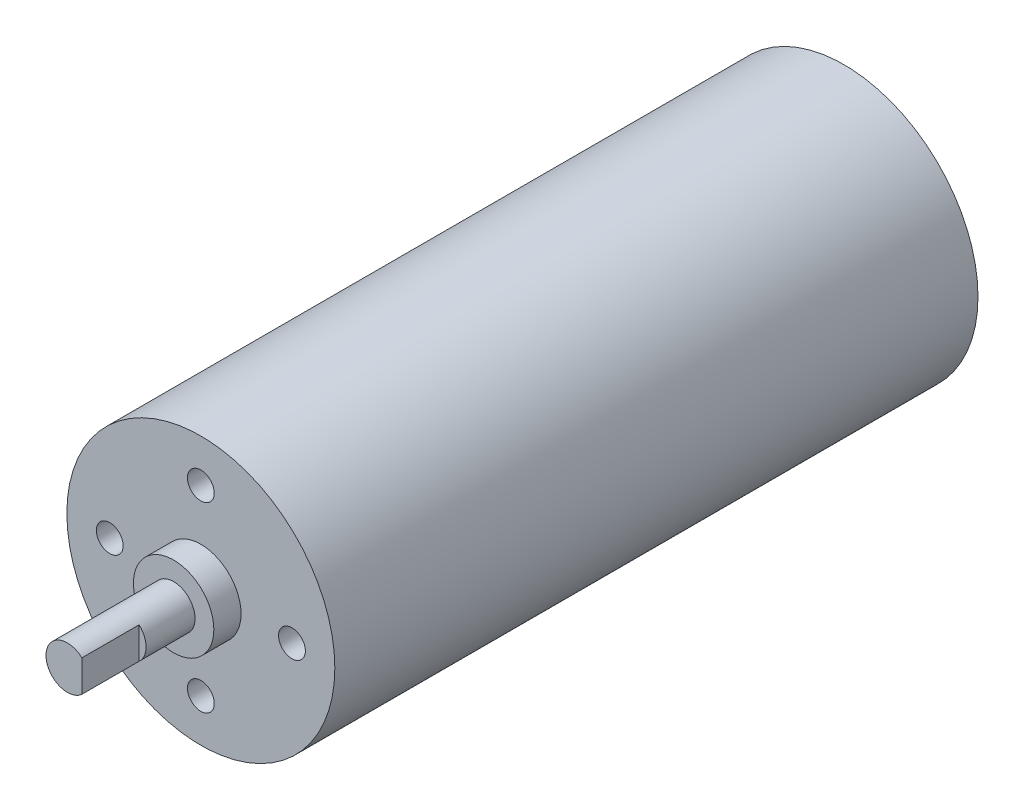
ISO-10303-21;
HEADER;
FILE_DESCRIPTION(('STEP AP214'),'2;1');
FILE_NAME('part.step','',(''),(''),'','','');
FILE_SCHEMA(('AUTOMOTIVE_DESIGN { 1 0 10303 214 1 1 1 1 }'));
ENDSEC;
DATA;
#1=APPLICATION_CONTEXT('core data for automotive mechanical design processes');
#2=APPLICATION_PROTOCOL_DEFINITION('international standard','automotive_design',2000,#1);
#3=PRODUCT_CONTEXT('',#1,'mechanical');
#4=PRODUCT('Part','Part','',(#3));
#5=PRODUCT_RELATED_PRODUCT_CATEGORY('part','',(#4));
#6=PRODUCT_DEFINITION_FORMATION('','',#4);
#7=PRODUCT_DEFINITION_CONTEXT('part definition',#1,'design');
#8=PRODUCT_DEFINITION('design','',#6,#7);
#9=PRODUCT_DEFINITION_SHAPE('','',#8);
#10=(LENGTH_UNIT() NAMED_UNIT(*) SI_UNIT(.MILLI.,.METRE.));
#11=(NAMED_UNIT(*) PLANE_ANGLE_UNIT() SI_UNIT($,.RADIAN.));
#12=(NAMED_UNIT(*) SI_UNIT($,.STERADIAN.) SOLID_ANGLE_UNIT());
#13=UNCERTAINTY_MEASURE_WITH_UNIT(LENGTH_MEASURE(1.E-05),#10,'distance_accuracy_value','');
#14=(GEOMETRIC_REPRESENTATION_CONTEXT(3) GLOBAL_UNCERTAINTY_ASSIGNED_CONTEXT((#13)) GLOBAL_UNIT_ASSIGNED_CONTEXT((#10,
#11,#12)) REPRESENTATION_CONTEXT('',''));
#15=CARTESIAN_POINT('',(0.,0.,0.));
#16=DIRECTION('',(0.,0.,1.));
#17=DIRECTION('',(1.,0.,0.));
#18=AXIS2_PLACEMENT_3D('',#15,#16,#17);
#19=CARTESIAN_POINT('',(0.,0.,-60.));
#20=DIRECTION('',(0.,0.,1.));
#21=DIRECTION('',(1.,0.,0.));
#22=AXIS2_PLACEMENT_3D('',#19,#20,#21);
#23=CYLINDRICAL_SURFACE('',#22,12.5);
#24=CARTESIAN_POINT('',(0.,0.,-60.));
#25=DIRECTION('',(0.,0.,1.));
#26=DIRECTION('',(1.,0.,0.));
#27=AXIS2_PLACEMENT_3D('',#24,#25,#26);
#28=CIRCLE('',#27,12.5);
#29=CARTESIAN_POINT('',(12.5,0.,-60.));
#30=VERTEX_POINT('',#29);
#31=EDGE_CURVE('E11',#30,#30,#28,.T.);
#32=CARTESIAN_POINT('',(0.,0.,0.));
#33=DIRECTION('',(0.,0.,1.));
#34=DIRECTION('',(1.,0.,0.));
#35=AXIS2_PLACEMENT_3D('',#32,#33,#34);
#36=CIRCLE('',#35,12.5);
#37=CARTESIAN_POINT('',(12.5,0.,0.));
#38=VERTEX_POINT('',#37);
#39=EDGE_CURVE('E43',#38,#38,#36,.T.);
#40=CARTESIAN_POINT('',(12.5,0.,-60.));
#41=CARTESIAN_POINT('',(12.5,0.,-59.375));
#42=CARTESIAN_POINT('',(12.5,0.,-58.75));
#43=CARTESIAN_POINT('',(12.5,0.,-57.5));
#44=CARTESIAN_POINT('',(12.5,0.,-56.875));
#45=CARTESIAN_POINT('',(12.5,0.,-55.625));
#46=CARTESIAN_POINT('',(12.5,0.,-55.));
#47=CARTESIAN_POINT('',(12.5,0.,-53.75));
#48=CARTESIAN_POINT('',(12.5,0.,-53.125));
#49=CARTESIAN_POINT('',(12.5,0.,-51.875));
#50=CARTESIAN_POINT('',(12.5,0.,-51.25));
#51=CARTESIAN_POINT('',(12.5,0.,-50.));
#52=CARTESIAN_POINT('',(12.5,0.,-49.375));
#53=CARTESIAN_POINT('',(12.5,0.,-48.125));
#54=CARTESIAN_POINT('',(12.5,0.,-47.5));
#55=CARTESIAN_POINT('',(12.5,0.,-46.25));
#56=CARTESIAN_POINT('',(12.5,0.,-45.625));
#57=CARTESIAN_POINT('',(12.5,0.,-44.375));
#58=CARTESIAN_POINT('',(12.5,0.,-43.75));
#59=CARTESIAN_POINT('',(12.5,0.,-42.5));
#60=CARTESIAN_POINT('',(12.5,0.,-41.875));
#61=CARTESIAN_POINT('',(12.5,0.,-40.625));
#62=CARTESIAN_POINT('',(12.5,0.,-40.));
#63=CARTESIAN_POINT('',(12.5,0.,-38.75));
#64=CARTESIAN_POINT('',(12.5,0.,-38.125));
#65=CARTESIAN_POINT('',(12.5,0.,-36.875));
#66=CARTESIAN_POINT('',(12.5,0.,-36.25));
#67=CARTESIAN_POINT('',(12.5,0.,-35.));
#68=CARTESIAN_POINT('',(12.5,0.,-34.375));
#69=CARTESIAN_POINT('',(12.5,0.,-33.125));
#70=CARTESIAN_POINT('',(12.5,0.,-32.5));
#71=CARTESIAN_POINT('',(12.5,0.,-31.25));
#72=CARTESIAN_POINT('',(12.5,0.,-30.625));
#73=CARTESIAN_POINT('',(12.5,0.,-29.375));
#74=CARTESIAN_POINT('',(12.5,0.,-28.75));
#75=CARTESIAN_POINT('',(12.5,0.,-27.5));
#76=CARTESIAN_POINT('',(12.5,0.,-26.875));
#77=CARTESIAN_POINT('',(12.5,0.,-25.625));
#78=CARTESIAN_POINT('',(12.5,0.,-25.));
#79=CARTESIAN_POINT('',(12.5,0.,-23.75));
#80=CARTESIAN_POINT('',(12.5,0.,-23.125));
#81=CARTESIAN_POINT('',(12.5,0.,-21.875));
#82=CARTESIAN_POINT('',(12.5,0.,-21.25));
#83=CARTESIAN_POINT('',(12.5,0.,-20.));
#84=CARTESIAN_POINT('',(12.5,0.,-19.375));
#85=CARTESIAN_POINT('',(12.5,0.,-18.125));
#86=CARTESIAN_POINT('',(12.5,0.,-17.5));
#87=CARTESIAN_POINT('',(12.5,0.,-16.25));
#88=CARTESIAN_POINT('',(12.5,0.,-15.625));
#89=CARTESIAN_POINT('',(12.5,0.,-14.375));
#90=CARTESIAN_POINT('',(12.5,0.,-13.75));
#91=CARTESIAN_POINT('',(12.5,0.,-12.5));
#92=CARTESIAN_POINT('',(12.5,0.,-11.875));
#93=CARTESIAN_POINT('',(12.5,0.,-10.625));
#94=CARTESIAN_POINT('',(12.5,0.,-10.));
#95=CARTESIAN_POINT('',(12.5,0.,-8.75));
#96=CARTESIAN_POINT('',(12.5,0.,-8.125));
#97=CARTESIAN_POINT('',(12.5,0.,-6.875));
#98=CARTESIAN_POINT('',(12.5,0.,-6.25));
#99=CARTESIAN_POINT('',(12.5,0.,-5.));
#100=CARTESIAN_POINT('',(12.5,0.,-4.375));
#101=CARTESIAN_POINT('',(12.5,0.,-3.125));
#102=CARTESIAN_POINT('',(12.5,0.,-2.5));
#103=CARTESIAN_POINT('',(12.5,0.,-1.25));
#104=CARTESIAN_POINT('',(12.5,0.,-0.625000000000001));
#105=CARTESIAN_POINT('',(12.5,0.,0.));
#106=B_SPLINE_CURVE_WITH_KNOTS('',3,(#40,#41,#42,#43,#44,#45,#46,#47,#48,#49,#50,#51,#52,#53,
#54,#55,#56,#57,#58,#59,#60,#61,#62,#63,#64,#65,#66,#67,#68,#69,#70,#71,#72,#73,#74,#75,#76,#77,
#78,#79,#80,#81,#82,#83,#84,#85,#86,#87,#88,#89,#90,#91,#92,#93,#94,#95,#96,#97,#98,#99,#100,
#101,#102,#103,#104,#105),.UNSPECIFIED.,.F.,.F.,(4,2,2,2,2,2,2,2,2,2,2,2,2,2,2,2,2,2,2,2,2,2,2,
2,2,2,2,2,2,2,2,2,4),(0.,1.875,3.75,5.62500000000001,7.50000000000001,9.37500000000001,11.25,
13.125,15.,16.875,18.75,20.625,22.5,24.375,26.25,28.125,30.,31.875,33.75,35.625,37.5,39.375,
41.25,43.125,45.,46.875,48.75,50.625,52.5,54.375,56.25,58.125,60.),.UNSPECIFIED.);
#107=EDGE_CURVE('BSEAM35',#30,#38,#106,.T.);
#108=ORIENTED_EDGE('',*,*,#31,.T.);
#109=ORIENTED_EDGE('',*,*,#39,.F.);
#110=ORIENTED_EDGE('',*,*,#107,.T.);
#111=ORIENTED_EDGE('',*,*,#107,.F.);
#112=EDGE_LOOP('',(#108,#110,#109,#111));
#113=FACE_BOUND('',#112,.T.);
#114=ADVANCED_FACE('F35',(#113),#23,.T.);
#115=CARTESIAN_POINT('',(0.,0.,-60.));
#116=DIRECTION('',(0.,0.,1.));
#117=DIRECTION('',(1.,0.,0.));
#118=AXIS2_PLACEMENT_3D('',#115,#116,#117);
#119=PLANE('',#118);
#120=ORIENTED_EDGE('',*,*,#31,.F.);
#121=EDGE_LOOP('',(#120));
#122=FACE_BOUND('',#121,.T.);
#123=ADVANCED_FACE('F134',(#122),#119,.F.);
#124=CARTESIAN_POINT('',(0.,0.,0.));
#125=DIRECTION('',(0.,0.,1.));
#126=DIRECTION('',(1.,0.,0.));
#127=AXIS2_PLACEMENT_3D('',#124,#125,#126);
#128=PLANE('',#127);
#129=CARTESIAN_POINT('',(0.,8.5,0.));
#130=DIRECTION('',(0.,0.,1.));
#131=DIRECTION('',(1.,0.,0.));
#132=AXIS2_PLACEMENT_3D('',#129,#130,#131);
#133=CIRCLE('',#132,1.24999999999999);
#134=CARTESIAN_POINT('',(1.24999999999999,8.5,0.));
#135=VERTEX_POINT('',#134);
#136=EDGE_CURVE('E90',#135,#135,#133,.T.);
#137=ORIENTED_EDGE('',*,*,#136,.F.);
#138=EDGE_LOOP('',(#137));
#139=FACE_BOUND('',#138,.T.);
#140=CARTESIAN_POINT('',(8.5,0.,0.));
#141=DIRECTION('',(0.,0.,1.));
#142=DIRECTION('',(1.,0.,0.));
#143=AXIS2_PLACEMENT_3D('',#140,#141,#142);
#144=CIRCLE('',#143,1.24999999999999);
#145=CARTESIAN_POINT('',(9.74999999999999,0.,0.));
#146=VERTEX_POINT('',#145);
#147=EDGE_CURVE('E89',#146,#146,#144,.T.);
#148=ORIENTED_EDGE('',*,*,#147,.F.);
#149=EDGE_LOOP('',(#148));
#150=FACE_BOUND('',#149,.T.);
#151=CARTESIAN_POINT('',(0.,-8.5,0.));
#152=DIRECTION('',(0.,0.,1.));
#153=DIRECTION('',(1.,0.,0.));
#154=AXIS2_PLACEMENT_3D('',#151,#152,#153);
#155=CIRCLE('',#154,1.24999999999999);
#156=CARTESIAN_POINT('',(1.24999999999999,-8.5,0.));
#157=VERTEX_POINT('',#156);
#158=EDGE_CURVE('E100',#157,#157,#155,.T.);
#159=ORIENTED_EDGE('',*,*,#158,.F.);
#160=EDGE_LOOP('',(#159));
#161=FACE_BOUND('',#160,.T.);
#162=CARTESIAN_POINT('',(-8.5,0.,0.));
#163=DIRECTION('',(0.,0.,1.));
#164=DIRECTION('',(1.,0.,0.));
#165=AXIS2_PLACEMENT_3D('',#162,#163,#164);
#166=CIRCLE('',#165,1.24999999999999);
#167=CARTESIAN_POINT('',(-7.25000000000001,0.,0.));
#168=VERTEX_POINT('',#167);
#169=EDGE_CURVE('E106',#168,#168,#166,.T.);
#170=ORIENTED_EDGE('',*,*,#169,.F.);
#171=EDGE_LOOP('',(#170));
#172=FACE_BOUND('',#171,.T.);
#173=CARTESIAN_POINT('',(0.,0.,0.));
#174=DIRECTION('',(0.,0.,1.));
#175=DIRECTION('',(1.,0.,0.));
#176=AXIS2_PLACEMENT_3D('',#173,#174,#175);
#177=CIRCLE('',#176,3.75);
#178=CARTESIAN_POINT('',(3.75,0.,0.));
#179=VERTEX_POINT('',#178);
#180=EDGE_CURVE('E119',#179,#179,#177,.T.);
#181=ORIENTED_EDGE('',*,*,#180,.F.);
#182=EDGE_LOOP('',(#181));
#183=FACE_BOUND('',#182,.T.);
#184=ORIENTED_EDGE('',*,*,#39,.T.);
#185=EDGE_LOOP('',(#184));
#186=FACE_BOUND('',#185,.T.);
#187=ADVANCED_FACE('F131',(#139,#150,#161,#172,#183,#186),#128,.T.);
#188=CARTESIAN_POINT('',(0.,0.,2.54));
#189=DIRECTION('',(0.,0.,-1.));
#190=DIRECTION('',(-1.,0.,0.));
#191=AXIS2_PLACEMENT_3D('',#188,#189,#190);
#192=CYLINDRICAL_SURFACE('',#191,3.75);
#193=CARTESIAN_POINT('',(0.,0.,2.54));
#194=DIRECTION('',(0.,0.,1.));
#195=DIRECTION('',(1.,0.,0.));
#196=AXIS2_PLACEMENT_3D('',#193,#194,#195);
#197=CIRCLE('',#196,3.75);
#198=CARTESIAN_POINT('',(3.75,0.,2.54));
#199=VERTEX_POINT('',#198);
#200=EDGE_CURVE('E121',#199,#199,#197,.T.);
#201=ORIENTED_EDGE('',*,*,#200,.F.);
#202=EDGE_LOOP('',(#201));
#203=FACE_BOUND('',#202,.T.);
#204=ORIENTED_EDGE('',*,*,#180,.T.);
#205=EDGE_LOOP('',(#204));
#206=FACE_BOUND('',#205,.T.);
#207=ADVANCED_FACE('F145',(#203,#206),#192,.T.);
#208=CARTESIAN_POINT('',(0.,0.,2.54));
#209=DIRECTION('',(0.,0.,1.));
#210=DIRECTION('',(1.,0.,0.));
#211=AXIS2_PLACEMENT_3D('',#208,#209,#210);
#212=PLANE('',#211);
#213=CARTESIAN_POINT('',(0.,0.,2.54));
#214=DIRECTION('',(0.,0.,1.));
#215=DIRECTION('',(1.,0.,0.));
#216=AXIS2_PLACEMENT_3D('',#213,#214,#215);
#217=CIRCLE('',#216,2.);
#218=CARTESIAN_POINT('',(2.,0.,2.54));
#219=VERTEX_POINT('',#218);
#220=EDGE_CURVE('E38',#219,#219,#217,.T.);
#221=ORIENTED_EDGE('',*,*,#220,.F.);
#222=EDGE_LOOP('',(#221));
#223=FACE_BOUND('',#222,.T.);
#224=ORIENTED_EDGE('',*,*,#200,.T.);
#225=EDGE_LOOP('',(#224));
#226=FACE_BOUND('',#225,.T.);
#227=ADVANCED_FACE('F156',(#223,#226),#212,.T.);
#228=CARTESIAN_POINT('',(0.,0.,12.446));
#229=DIRECTION('',(0.,0.,1.));
#230=DIRECTION('',(1.,0.,0.));
#231=AXIS2_PLACEMENT_3D('',#228,#229,#230);
#232=PLANE('',#231);
#233=DIRECTION('',(0.,-1.,0.));
#234=VECTOR('',#233,1.);
#235=CARTESIAN_POINT('',(1.35278763968927,1.47308031074478,12.446));
#236=LINE('',#235,#234);
#237=CARTESIAN_POINT('',(1.35278763968927,1.47308031074478,12.446));
#238=VERTEX_POINT('',#237);
#239=CARTESIAN_POINT('',(1.35278763968927,-1.47308031074478,12.446));
#240=VERTEX_POINT('',#239);
#241=EDGE_CURVE('E112',#238,#240,#236,.T.);
#242=ORIENTED_EDGE('',*,*,#241,.F.);
#243=CARTESIAN_POINT('',(0.,0.,12.446));
#244=DIRECTION('',(0.,0.,1.));
#245=DIRECTION('',(1.,0.,0.));
#246=AXIS2_PLACEMENT_3D('',#243,#244,#245);
#247=CIRCLE('',#246,2.);
#248=EDGE_CURVE('E126',#238,#240,#247,.T.);
#249=ORIENTED_EDGE('',*,*,#248,.T.);
#250=EDGE_LOOP('',(#242,#249));
#251=FACE_BOUND('',#250,.T.);
#252=ADVANCED_FACE('F152',(#251),#232,.T.);
#253=CARTESIAN_POINT('',(0.,0.,12.446));
#254=DIRECTION('',(0.,0.,-1.));
#255=DIRECTION('',(-1.,0.,0.));
#256=AXIS2_PLACEMENT_3D('',#253,#254,#255);
#257=CYLINDRICAL_SURFACE('',#256,2.);
#258=ORIENTED_EDGE('',*,*,#248,.F.);
#259=DIRECTION('',(0.,0.,1.));
#260=VECTOR('',#259,1.);
#261=CARTESIAN_POINT('',(1.35278763968927,1.47308031074478,7.112));
#262=LINE('',#261,#260);
#263=CARTESIAN_POINT('',(1.35278763968927,1.47308031074478,7.112));
#264=VERTEX_POINT('',#263);
#265=EDGE_CURVE('E65',#264,#238,#262,.T.);
#266=ORIENTED_EDGE('',*,*,#265,.F.);
#267=CARTESIAN_POINT('',(0.,0.,7.112));
#268=DIRECTION('',(0.,0.,1.));
#269=DIRECTION('',(-1.,0.,0.));
#270=AXIS2_PLACEMENT_3D('',#267,#268,#269);
#271=CIRCLE('',#270,2.);
#272=CARTESIAN_POINT('',(1.35278763968927,-1.47308031074478,7.112));
#273=VERTEX_POINT('',#272);
#274=EDGE_CURVE('E55',#273,#264,#271,.T.);
#275=ORIENTED_EDGE('',*,*,#274,.F.);
#276=DIRECTION('',(0.,0.,1.));
#277=VECTOR('',#276,1.);
#278=CARTESIAN_POINT('',(1.35278763968927,-1.47308031074478,7.112));
#279=LINE('',#278,#277);
#280=EDGE_CURVE('E116',#273,#240,#279,.T.);
#281=ORIENTED_EDGE('',*,*,#280,.T.);
#282=EDGE_LOOP('',(#258,#266,#275,#281));
#283=FACE_BOUND('',#282,.T.);
#284=ORIENTED_EDGE('',*,*,#220,.T.);
#285=EDGE_LOOP('',(#284));
#286=FACE_BOUND('',#285,.T.);
#287=ADVANCED_FACE('F148',(#283,#286),#257,.T.);
#288=CARTESIAN_POINT('',(1.35278763968927,1.47308031074478,7.112));
#289=DIRECTION('',(-1.,0.,0.));
#290=DIRECTION('',(0.,0.,1.));
#291=AXIS2_PLACEMENT_3D('',#288,#289,#290);
#292=PLANE('',#291);
#293=ORIENTED_EDGE('',*,*,#241,.T.);
#294=ORIENTED_EDGE('',*,*,#280,.F.);
#295=DIRECTION('',(0.,-1.,0.));
#296=VECTOR('',#295,1.);
#297=CARTESIAN_POINT('',(1.35278763968927,1.47308031074478,7.112));
#298=LINE('',#297,#296);
#299=EDGE_CURVE('E50',#264,#273,#298,.T.);
#300=ORIENTED_EDGE('',*,*,#299,.F.);
#301=ORIENTED_EDGE('',*,*,#265,.T.);
#302=EDGE_LOOP('',(#293,#294,#300,#301));
#303=FACE_BOUND('',#302,.T.);
#304=ADVANCED_FACE('F151',(#303),#292,.F.);
#305=CARTESIAN_POINT('',(0.,0.,7.112));
#306=DIRECTION('',(0.,0.,-1.));
#307=DIRECTION('',(-1.,0.,0.));
#308=AXIS2_PLACEMENT_3D('',#305,#306,#307);
#309=PLANE('',#308);
#310=ORIENTED_EDGE('',*,*,#274,.T.);
#311=ORIENTED_EDGE('',*,*,#299,.T.);
#312=EDGE_LOOP('',(#310,#311));
#313=FACE_BOUND('',#312,.T.);
#314=ADVANCED_FACE('F166',(#313),#309,.F.);
#315=CARTESIAN_POINT('',(-8.5,0.,-10.0000054));
#316=DIRECTION('',(0.,0.,1.));
#317=DIRECTION('',(1.,0.,0.));
#318=AXIS2_PLACEMENT_3D('',#315,#316,#317);
#319=CONICAL_SURFACE('',#318,1.25,1.02974425867665);
#320=CARTESIAN_POINT('',(-8.5,0.,-10.7510811737845));
#321=VERTEX_POINT('',#320);
#322=VERTEX_LOOP('',#321);
#323=FACE_BOUND('',#322,.T.);
#324=CARTESIAN_POINT('',(-8.5,0.,-10.0000054));
#325=DIRECTION('',(0.,0.,1.));
#326=DIRECTION('',(1.,0.,0.));
#327=AXIS2_PLACEMENT_3D('',#324,#325,#326);
#328=CIRCLE('',#327,1.25);
#329=CARTESIAN_POINT('',(-7.25,0.,-10.0000054));
#330=VERTEX_POINT('',#329);
#331=EDGE_CURVE('E109',#330,#330,#328,.T.);
#332=ORIENTED_EDGE('',*,*,#331,.T.);
#333=EDGE_LOOP('',(#332));
#334=FACE_BOUND('',#333,.T.);
#335=ADVANCED_FACE('F169',(#323,#334),#319,.F.);
#336=CARTESIAN_POINT('',(-8.5,0.,0.));
#337=DIRECTION('',(0.,0.,1.));
#338=DIRECTION('',(1.,0.,0.));
#339=AXIS2_PLACEMENT_3D('',#336,#337,#338);
#340=CYLINDRICAL_SURFACE('',#339,1.24999999999999);
#341=ORIENTED_EDGE('',*,*,#331,.F.);
#342=EDGE_LOOP('',(#341));
#343=FACE_BOUND('',#342,.T.);
#344=ORIENTED_EDGE('',*,*,#169,.T.);
#345=EDGE_LOOP('',(#344));
#346=FACE_BOUND('',#345,.T.);
#347=ADVANCED_FACE('F172',(#343,#346),#340,.F.);
#348=CARTESIAN_POINT('',(0.,-8.5,-10.0000054));
#349=DIRECTION('',(0.,0.,1.));
#350=DIRECTION('',(1.,0.,0.));
#351=AXIS2_PLACEMENT_3D('',#348,#349,#350);
#352=CONICAL_SURFACE('',#351,1.25,1.02974425867665);
#353=CARTESIAN_POINT('',(0.,-8.5,-10.7510811737845));
#354=VERTEX_POINT('',#353);
#355=VERTEX_LOOP('',#354);
#356=FACE_BOUND('',#355,.T.);
#357=CARTESIAN_POINT('',(0.,-8.5,-10.0000054));
#358=DIRECTION('',(0.,0.,1.));
#359=DIRECTION('',(1.,0.,0.));
#360=AXIS2_PLACEMENT_3D('',#357,#358,#359);
#361=CIRCLE('',#360,1.25);
#362=CARTESIAN_POINT('',(1.25,-8.5,-10.0000054));
#363=VERTEX_POINT('',#362);
#364=EDGE_CURVE('E103',#363,#363,#361,.T.);
#365=ORIENTED_EDGE('',*,*,#364,.T.);
#366=EDGE_LOOP('',(#365));
#367=FACE_BOUND('',#366,.T.);
#368=ADVANCED_FACE('F175',(#356,#367),#352,.F.);
#369=CARTESIAN_POINT('',(0.,-8.5,0.));
#370=DIRECTION('',(0.,0.,1.));
#371=DIRECTION('',(1.,0.,0.));
#372=AXIS2_PLACEMENT_3D('',#369,#370,#371);
#373=CYLINDRICAL_SURFACE('',#372,1.24999999999999);
#374=ORIENTED_EDGE('',*,*,#364,.F.);
#375=EDGE_LOOP('',(#374));
#376=FACE_BOUND('',#375,.T.);
#377=ORIENTED_EDGE('',*,*,#158,.T.);
#378=EDGE_LOOP('',(#377));
#379=FACE_BOUND('',#378,.T.);
#380=ADVANCED_FACE('F179',(#376,#379),#373,.F.);
#381=CARTESIAN_POINT('',(8.5,0.,-10.0000054));
#382=DIRECTION('',(0.,0.,1.));
#383=DIRECTION('',(1.,0.,0.));
#384=AXIS2_PLACEMENT_3D('',#381,#382,#383);
#385=CONICAL_SURFACE('',#384,1.25,1.02974425867665);
#386=CARTESIAN_POINT('',(8.5,0.,-10.7510811737845));
#387=VERTEX_POINT('',#386);
#388=VERTEX_LOOP('',#387);
#389=FACE_BOUND('',#388,.T.);
#390=CARTESIAN_POINT('',(8.5,0.,-10.0000054));
#391=DIRECTION('',(0.,0.,1.));
#392=DIRECTION('',(1.,0.,0.));
#393=AXIS2_PLACEMENT_3D('',#390,#391,#392);
#394=CIRCLE('',#393,1.25);
#395=CARTESIAN_POINT('',(9.75,0.,-10.0000054));
#396=VERTEX_POINT('',#395);
#397=EDGE_CURVE('E93',#396,#396,#394,.T.);
#398=ORIENTED_EDGE('',*,*,#397,.T.);
#399=EDGE_LOOP('',(#398));
#400=FACE_BOUND('',#399,.T.);
#401=ADVANCED_FACE('F182',(#389,#400),#385,.F.);
#402=CARTESIAN_POINT('',(8.5,0.,0.));
#403=DIRECTION('',(0.,0.,1.));
#404=DIRECTION('',(1.,0.,0.));
#405=AXIS2_PLACEMENT_3D('',#402,#403,#404);
#406=CYLINDRICAL_SURFACE('',#405,1.24999999999999);
#407=ORIENTED_EDGE('',*,*,#397,.F.);
#408=EDGE_LOOP('',(#407));
#409=FACE_BOUND('',#408,.T.);
#410=ORIENTED_EDGE('',*,*,#147,.T.);
#411=EDGE_LOOP('',(#410));
#412=FACE_BOUND('',#411,.T.);
#413=ADVANCED_FACE('F83',(#409,#412),#406,.F.);
#414=CARTESIAN_POINT('',(0.,8.5,-10.0000054));
#415=DIRECTION('',(0.,0.,1.));
#416=DIRECTION('',(1.,0.,0.));
#417=AXIS2_PLACEMENT_3D('',#414,#415,#416);
#418=CONICAL_SURFACE('',#417,1.25,1.02974425867665);
#419=CARTESIAN_POINT('',(0.,8.5,-10.7510811737845));
#420=VERTEX_POINT('',#419);
#421=VERTEX_LOOP('',#420);
#422=FACE_BOUND('',#421,.T.);
#423=CARTESIAN_POINT('',(0.,8.5,-10.0000054));
#424=DIRECTION('',(0.,0.,1.));
#425=DIRECTION('',(1.,0.,0.));
#426=AXIS2_PLACEMENT_3D('',#423,#424,#425);
#427=CIRCLE('',#426,1.25);
#428=CARTESIAN_POINT('',(1.25,8.5,-10.0000054));
#429=VERTEX_POINT('',#428);
#430=EDGE_CURVE('E87',#429,#429,#427,.T.);
#431=ORIENTED_EDGE('',*,*,#430,.T.);
#432=EDGE_LOOP('',(#431));
#433=FACE_BOUND('',#432,.T.);
#434=ADVANCED_FACE('F79',(#422,#433),#418,.F.);
#435=CARTESIAN_POINT('',(0.,8.5,0.));
#436=DIRECTION('',(0.,0.,1.));
#437=DIRECTION('',(1.,0.,0.));
#438=AXIS2_PLACEMENT_3D('',#435,#436,#437);
#439=CYLINDRICAL_SURFACE('',#438,1.24999999999999);
#440=ORIENTED_EDGE('',*,*,#430,.F.);
#441=EDGE_LOOP('',(#440));
#442=FACE_BOUND('',#441,.T.);
#443=ORIENTED_EDGE('',*,*,#136,.T.);
#444=EDGE_LOOP('',(#443));
#445=FACE_BOUND('',#444,.T.);
#446=ADVANCED_FACE('F82',(#442,#445),#439,.F.);
#447=CLOSED_SHELL('',(#114,#123,#187,#207,#227,#252,#287,#304,#314,#335,#347,#368,#380,#401,
#413,#434,#446));
#448=MANIFOLD_SOLID_BREP('B2',#447);
#449=ADVANCED_BREP_SHAPE_REPRESENTATION('',(#18,#448),#14);
#450=SHAPE_DEFINITION_REPRESENTATION(#9,#449);
ENDSEC;
END-ISO-10303-21;
